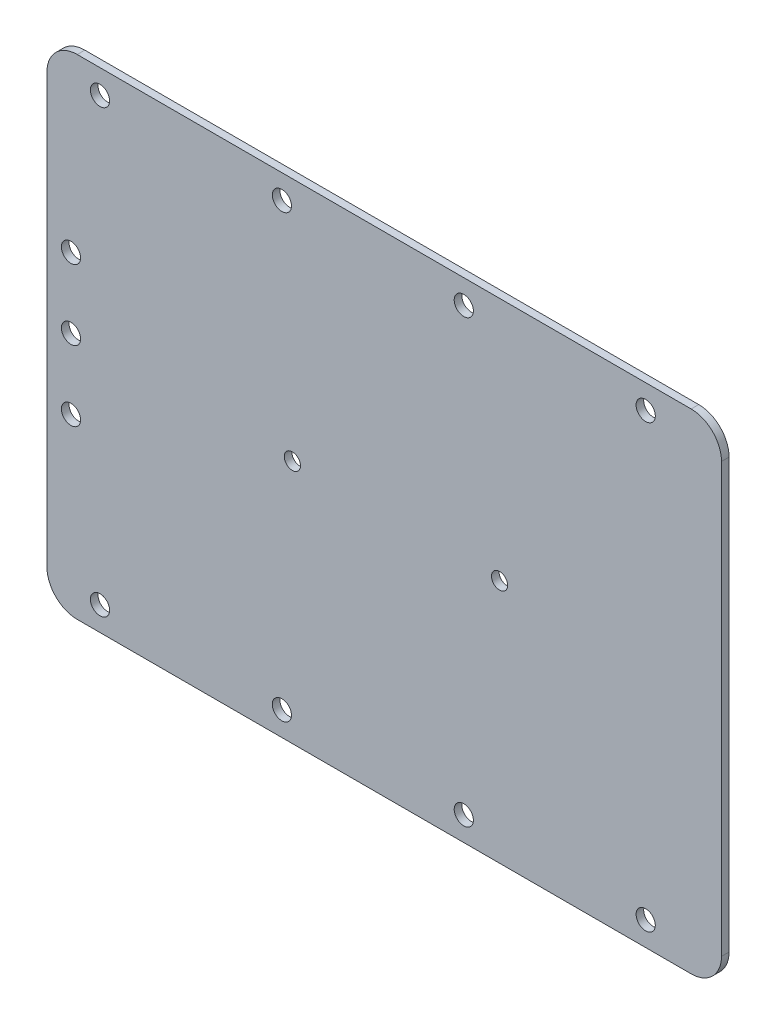
ISO-10303-21;
HEADER;
FILE_DESCRIPTION(('STEP AP214'),'2;1');
FILE_NAME('part.step','',(''),(''),'','','');
FILE_SCHEMA(('AUTOMOTIVE_DESIGN { 1 0 10303 214 1 1 1 1 }'));
ENDSEC;
DATA;
#1=APPLICATION_CONTEXT('core data for automotive mechanical design processes');
#2=APPLICATION_PROTOCOL_DEFINITION('international standard','automotive_design',2000,#1);
#3=PRODUCT_CONTEXT('',#1,'mechanical');
#4=PRODUCT('Part','Part','',(#3));
#5=PRODUCT_RELATED_PRODUCT_CATEGORY('part','',(#4));
#6=PRODUCT_DEFINITION_FORMATION('','',#4);
#7=PRODUCT_DEFINITION_CONTEXT('part definition',#1,'design');
#8=PRODUCT_DEFINITION('design','',#6,#7);
#9=PRODUCT_DEFINITION_SHAPE('','',#8);
#10=(LENGTH_UNIT() NAMED_UNIT(*) SI_UNIT(.MILLI.,.METRE.));
#11=(NAMED_UNIT(*) PLANE_ANGLE_UNIT() SI_UNIT($,.RADIAN.));
#12=(NAMED_UNIT(*) SI_UNIT($,.STERADIAN.) SOLID_ANGLE_UNIT());
#13=UNCERTAINTY_MEASURE_WITH_UNIT(LENGTH_MEASURE(1.E-05),#10,'distance_accuracy_value','');
#14=(GEOMETRIC_REPRESENTATION_CONTEXT(3) GLOBAL_UNCERTAINTY_ASSIGNED_CONTEXT((#13)) GLOBAL_UNIT_ASSIGNED_CONTEXT((#10,
#11,#12)) REPRESENTATION_CONTEXT('',''));
#15=CARTESIAN_POINT('',(0.,0.,0.));
#16=DIRECTION('',(0.,0.,1.));
#17=DIRECTION('',(1.,0.,0.));
#18=AXIS2_PLACEMENT_3D('',#15,#16,#17);
#19=CARTESIAN_POINT('',(-59.5125,-25.,1.5));
#20=DIRECTION('',(0.,0.,1.));
#21=DIRECTION('',(1.,0.,0.));
#22=AXIS2_PLACEMENT_3D('',#19,#20,#21);
#23=CYLINDRICAL_SURFACE('',#22,1.89864999999999);
#24=CARTESIAN_POINT('',(-59.5125,-25.,0.));
#25=DIRECTION('',(0.,0.,1.));
#26=DIRECTION('',(1.,0.,0.));
#27=AXIS2_PLACEMENT_3D('',#24,#25,#26);
#28=CIRCLE('',#27,1.89865);
#29=CARTESIAN_POINT('',(-57.61385,-25.,0.));
#30=VERTEX_POINT('',#29);
#31=EDGE_CURVE('E169',#30,#30,#28,.T.);
#32=ORIENTED_EDGE('',*,*,#31,.F.);
#33=EDGE_LOOP('',(#32));
#34=FACE_BOUND('',#33,.T.);
#35=CARTESIAN_POINT('',(-59.5125,-25.,1.5));
#36=DIRECTION('',(0.,0.,1.));
#37=DIRECTION('',(1.,0.,0.));
#38=AXIS2_PLACEMENT_3D('',#35,#36,#37);
#39=CIRCLE('',#38,1.89864999999999);
#40=CARTESIAN_POINT('',(-57.61385,-25.,1.5));
#41=VERTEX_POINT('',#40);
#42=EDGE_CURVE('E171',#41,#41,#39,.T.);
#43=ORIENTED_EDGE('',*,*,#42,.T.);
#44=EDGE_LOOP('',(#43));
#45=FACE_BOUND('',#44,.T.);
#46=ADVANCED_FACE('F41',(#34,#45),#23,.F.);
#47=CARTESIAN_POINT('',(-53.7733140139944,4.7625,1.5));
#48=DIRECTION('',(0.,0.,1.));
#49=DIRECTION('',(1.,0.,0.));
#50=AXIS2_PLACEMENT_3D('',#47,#48,#49);
#51=CYLINDRICAL_SURFACE('',#50,1.89864999999999);
#52=CARTESIAN_POINT('',(-53.7733140139944,4.7625,0.));
#53=DIRECTION('',(0.,0.,1.));
#54=DIRECTION('',(1.,0.,0.));
#55=AXIS2_PLACEMENT_3D('',#52,#53,#54);
#56=CIRCLE('',#55,1.89865);
#57=CARTESIAN_POINT('',(-51.8746640139944,4.7625,0.));
#58=VERTEX_POINT('',#57);
#59=EDGE_CURVE('E159',#58,#58,#56,.T.);
#60=ORIENTED_EDGE('',*,*,#59,.F.);
#61=EDGE_LOOP('',(#60));
#62=FACE_BOUND('',#61,.T.);
#63=CARTESIAN_POINT('',(-53.7733140139944,4.7625,1.5));
#64=DIRECTION('',(0.,0.,1.));
#65=DIRECTION('',(1.,0.,0.));
#66=AXIS2_PLACEMENT_3D('',#63,#64,#65);
#67=CIRCLE('',#66,1.89864999999999);
#68=CARTESIAN_POINT('',(-51.8746640139944,4.7625,1.5));
#69=VERTEX_POINT('',#68);
#70=EDGE_CURVE('E165',#69,#69,#67,.T.);
#71=ORIENTED_EDGE('',*,*,#70,.T.);
#72=EDGE_LOOP('',(#71));
#73=FACE_BOUND('',#72,.T.);
#74=ADVANCED_FACE('F334',(#62,#73),#51,.F.);
#75=CARTESIAN_POINT('',(-17.7733140139944,4.7625,1.5));
#76=DIRECTION('',(0.,0.,1.));
#77=DIRECTION('',(1.,0.,0.));
#78=AXIS2_PLACEMENT_3D('',#75,#76,#77);
#79=CYLINDRICAL_SURFACE('',#78,1.89864999999999);
#80=CARTESIAN_POINT('',(-17.7733140139944,4.7625,0.));
#81=DIRECTION('',(0.,0.,1.));
#82=DIRECTION('',(1.,0.,0.));
#83=AXIS2_PLACEMENT_3D('',#80,#81,#82);
#84=CIRCLE('',#83,1.89865);
#85=CARTESIAN_POINT('',(-15.8746640139944,4.7625,0.));
#86=VERTEX_POINT('',#85);
#87=EDGE_CURVE('E152',#86,#86,#84,.T.);
#88=ORIENTED_EDGE('',*,*,#87,.F.);
#89=EDGE_LOOP('',(#88));
#90=FACE_BOUND('',#89,.T.);
#91=CARTESIAN_POINT('',(-17.7733140139944,4.7625,1.5));
#92=DIRECTION('',(0.,0.,1.));
#93=DIRECTION('',(1.,0.,0.));
#94=AXIS2_PLACEMENT_3D('',#91,#92,#93);
#95=CIRCLE('',#94,1.89864999999999);
#96=CARTESIAN_POINT('',(-15.8746640139944,4.7625,1.5));
#97=VERTEX_POINT('',#96);
#98=EDGE_CURVE('E155',#97,#97,#95,.T.);
#99=ORIENTED_EDGE('',*,*,#98,.T.);
#100=EDGE_LOOP('',(#99));
#101=FACE_BOUND('',#100,.T.);
#102=ADVANCED_FACE('F340',(#90,#101),#79,.F.);
#103=CARTESIAN_POINT('',(69.2266859860056,-87.3,1.5));
#104=DIRECTION('',(0.,1.,0.));
#105=DIRECTION('',(0.,0.,1.));
#106=AXIS2_PLACEMENT_3D('',#103,#104,#105);
#107=PLANE('',#106);
#108=DIRECTION('',(1.,0.,0.));
#109=VECTOR('',#108,1.);
#110=CARTESIAN_POINT('',(69.2266859860056,-87.3,1.5));
#111=LINE('',#110,#109);
#112=CARTESIAN_POINT('',(-58.275,-87.3,1.5));
#113=VERTEX_POINT('',#112);
#114=CARTESIAN_POINT('',(63.2266859860056,-87.3,1.5));
#115=VERTEX_POINT('',#114);
#116=EDGE_CURVE('E127',#113,#115,#111,.T.);
#117=ORIENTED_EDGE('',*,*,#116,.F.);
#118=DIRECTION('',(0.,0.,-1.));
#119=VECTOR('',#118,1.);
#120=CARTESIAN_POINT('',(-58.275,-87.3,1.5));
#121=LINE('',#120,#119);
#122=CARTESIAN_POINT('',(-58.275,-87.3,0.));
#123=VERTEX_POINT('',#122);
#124=EDGE_CURVE('E111',#113,#123,#121,.T.);
#125=ORIENTED_EDGE('',*,*,#124,.T.);
#126=DIRECTION('',(1.,0.,0.));
#127=VECTOR('',#126,1.);
#128=CARTESIAN_POINT('',(69.2266859860056,-87.3,0.));
#129=LINE('',#128,#127);
#130=CARTESIAN_POINT('',(63.2266859860056,-87.3,0.));
#131=VERTEX_POINT('',#130);
#132=EDGE_CURVE('E124',#123,#131,#129,.T.);
#133=ORIENTED_EDGE('',*,*,#132,.T.);
#134=DIRECTION('',(0.,0.,-1.));
#135=VECTOR('',#134,1.);
#136=CARTESIAN_POINT('',(63.2266859860056,-87.3,1.5));
#137=LINE('',#136,#135);
#138=EDGE_CURVE('E129',#131,#115,#137,.F.);
#139=ORIENTED_EDGE('',*,*,#138,.T.);
#140=EDGE_LOOP('',(#117,#125,#133,#139));
#141=FACE_BOUND('',#140,.T.);
#142=ADVANCED_FACE('F123',(#141),#107,.F.);
#143=CARTESIAN_POINT('',(69.2266859860056,9.525,1.5));
#144=DIRECTION('',(-1.,0.,0.));
#145=DIRECTION('',(0.,0.,1.));
#146=AXIS2_PLACEMENT_3D('',#143,#144,#145);
#147=PLANE('',#146);
#148=DIRECTION('',(0.,1.,0.));
#149=VECTOR('',#148,1.);
#150=CARTESIAN_POINT('',(69.2266859860056,9.525,0.));
#151=LINE('',#150,#149);
#152=CARTESIAN_POINT('',(69.2266859860056,-81.3,0.));
#153=VERTEX_POINT('',#152);
#154=CARTESIAN_POINT('',(69.2266859860056,3.525,0.));
#155=VERTEX_POINT('',#154);
#156=EDGE_CURVE('E135',#153,#155,#151,.T.);
#157=ORIENTED_EDGE('',*,*,#156,.T.);
#158=DIRECTION('',(0.,0.,-1.));
#159=VECTOR('',#158,1.);
#160=CARTESIAN_POINT('',(69.2266859860056,3.525,1.5));
#161=LINE('',#160,#159);
#162=CARTESIAN_POINT('',(69.2266859860056,3.525,1.5));
#163=VERTEX_POINT('',#162);
#164=EDGE_CURVE('E12',#155,#163,#161,.F.);
#165=ORIENTED_EDGE('',*,*,#164,.T.);
#166=DIRECTION('',(0.,1.,0.));
#167=VECTOR('',#166,1.);
#168=CARTESIAN_POINT('',(69.2266859860056,9.525,1.5));
#169=LINE('',#168,#167);
#170=CARTESIAN_POINT('',(69.2266859860056,-81.3,1.5));
#171=VERTEX_POINT('',#170);
#172=EDGE_CURVE('E196',#171,#163,#169,.T.);
#173=ORIENTED_EDGE('',*,*,#172,.F.);
#174=DIRECTION('',(0.,0.,-1.));
#175=VECTOR('',#174,1.);
#176=CARTESIAN_POINT('',(69.2266859860056,-81.3,1.5));
#177=LINE('',#176,#175);
#178=EDGE_CURVE('E49',#171,#153,#177,.T.);
#179=ORIENTED_EDGE('',*,*,#178,.T.);
#180=EDGE_LOOP('',(#157,#165,#173,#179));
#181=FACE_BOUND('',#180,.T.);
#182=ADVANCED_FACE('F366',(#181),#147,.F.);
#183=CARTESIAN_POINT('',(69.2266859860056,9.525,1.5));
#184=DIRECTION('',(0.,-1.,0.));
#185=DIRECTION('',(1.,0.,0.));
#186=AXIS2_PLACEMENT_3D('',#183,#184,#185);
#187=PLANE('',#186);
#188=DIRECTION('',(-1.,0.,0.));
#189=VECTOR('',#188,1.);
#190=CARTESIAN_POINT('',(69.2266859860056,9.525,1.5));
#191=LINE('',#190,#189);
#192=CARTESIAN_POINT('',(63.2266859860056,9.525,1.5));
#193=VERTEX_POINT('',#192);
#194=CARTESIAN_POINT('',(-58.275,9.525,1.5));
#195=VERTEX_POINT('',#194);
#196=EDGE_CURVE('E198',#193,#195,#191,.T.);
#197=ORIENTED_EDGE('',*,*,#196,.F.);
#198=DIRECTION('',(0.,0.,-1.));
#199=VECTOR('',#198,1.);
#200=CARTESIAN_POINT('',(63.2266859860056,9.525,1.5));
#201=LINE('',#200,#199);
#202=CARTESIAN_POINT('',(63.2266859860056,9.525,0.));
#203=VERTEX_POINT('',#202);
#204=EDGE_CURVE('E209',#193,#203,#201,.T.);
#205=ORIENTED_EDGE('',*,*,#204,.T.);
#206=DIRECTION('',(-1.,0.,0.));
#207=VECTOR('',#206,1.);
#208=CARTESIAN_POINT('',(69.2266859860056,9.525,0.));
#209=LINE('',#208,#207);
#210=CARTESIAN_POINT('',(-58.275,9.525,0.));
#211=VERTEX_POINT('',#210);
#212=EDGE_CURVE('E139',#203,#211,#209,.T.);
#213=ORIENTED_EDGE('',*,*,#212,.T.);
#214=DIRECTION('',(0.,0.,-1.));
#215=VECTOR('',#214,1.);
#216=CARTESIAN_POINT('',(-58.275,9.525,1.5));
#217=LINE('',#216,#215);
#218=EDGE_CURVE('E56',#211,#195,#217,.F.);
#219=ORIENTED_EDGE('',*,*,#218,.T.);
#220=EDGE_LOOP('',(#197,#205,#213,#219));
#221=FACE_BOUND('',#220,.T.);
#222=ADVANCED_FACE('F330',(#221),#187,.F.);
#223=CARTESIAN_POINT('',(-64.275,9.525,1.5));
#224=DIRECTION('',(1.,0.,0.));
#225=DIRECTION('',(0.,1.,0.));
#226=AXIS2_PLACEMENT_3D('',#223,#224,#225);
#227=PLANE('',#226);
#228=DIRECTION('',(0.,-1.,0.));
#229=VECTOR('',#228,1.);
#230=CARTESIAN_POINT('',(-64.275,9.525,0.));
#231=LINE('',#230,#229);
#232=CARTESIAN_POINT('',(-64.275,3.525,0.));
#233=VERTEX_POINT('',#232);
#234=CARTESIAN_POINT('',(-64.275,-81.3,0.));
#235=VERTEX_POINT('',#234);
#236=EDGE_CURVE('E150',#233,#235,#231,.T.);
#237=ORIENTED_EDGE('',*,*,#236,.T.);
#238=DIRECTION('',(0.,0.,-1.));
#239=VECTOR('',#238,1.);
#240=CARTESIAN_POINT('',(-64.275,-81.3,1.5));
#241=LINE('',#240,#239);
#242=CARTESIAN_POINT('',(-64.275,-81.3,1.5));
#243=VERTEX_POINT('',#242);
#244=EDGE_CURVE('E112',#235,#243,#241,.F.);
#245=ORIENTED_EDGE('',*,*,#244,.T.);
#246=DIRECTION('',(0.,-1.,0.));
#247=VECTOR('',#246,1.);
#248=CARTESIAN_POINT('',(-64.275,9.525,1.5));
#249=LINE('',#248,#247);
#250=CARTESIAN_POINT('',(-64.275,3.525,1.5));
#251=VERTEX_POINT('',#250);
#252=EDGE_CURVE('E145',#251,#243,#249,.T.);
#253=ORIENTED_EDGE('',*,*,#252,.F.);
#254=DIRECTION('',(0.,0.,-1.));
#255=VECTOR('',#254,1.);
#256=CARTESIAN_POINT('',(-64.275,3.52499999999999,1.5));
#257=LINE('',#256,#255);
#258=EDGE_CURVE('E117',#251,#233,#257,.T.);
#259=ORIENTED_EDGE('',*,*,#258,.T.);
#260=EDGE_LOOP('',(#237,#245,#253,#259));
#261=FACE_BOUND('',#260,.T.);
#262=ADVANCED_FACE('F325',(#261),#227,.F.);
#263=CARTESIAN_POINT('',(0.,0.,1.5));
#264=DIRECTION('',(0.,0.,1.));
#265=DIRECTION('',(1.,0.,0.));
#266=AXIS2_PLACEMENT_3D('',#263,#264,#265);
#267=PLANE('',#266);
#268=CARTESIAN_POINT('',(25.3010310682912,-38.8875101700014,1.5));
#269=DIRECTION('',(0.,0.,-1.));
#270=DIRECTION('',(-1.,0.,0.));
#271=AXIS2_PLACEMENT_3D('',#268,#269,#270);
#272=CIRCLE('',#271,1.6);
#273=CARTESIAN_POINT('',(23.7010310682912,-38.8875101700014,1.5));
#274=VERTEX_POINT('',#273);
#275=EDGE_CURVE('E274',#274,#274,#272,.T.);
#276=ORIENTED_EDGE('',*,*,#275,.T.);
#277=EDGE_LOOP('',(#276));
#278=FACE_BOUND('',#277,.T.);
#279=CARTESIAN_POINT('',(-15.699384734954,-38.8873831690102,1.5));
#280=DIRECTION('',(0.,0.,-1.));
#281=DIRECTION('',(-1.,0.,0.));
#282=AXIS2_PLACEMENT_3D('',#279,#280,#281);
#283=CIRCLE('',#282,1.6);
#284=CARTESIAN_POINT('',(-17.299384734954,-38.8873831690102,1.5));
#285=VERTEX_POINT('',#284);
#286=EDGE_CURVE('E278',#285,#285,#283,.T.);
#287=ORIENTED_EDGE('',*,*,#286,.T.);
#288=EDGE_LOOP('',(#287));
#289=FACE_BOUND('',#288,.T.);
#290=CARTESIAN_POINT('',(-59.5125,-38.8875,1.5));
#291=DIRECTION('',(0.,0.,1.));
#292=DIRECTION('',(1.,0.,0.));
#293=AXIS2_PLACEMENT_3D('',#290,#291,#292);
#294=CIRCLE('',#293,1.89864999999999);
#295=CARTESIAN_POINT('',(-57.61385,-38.8875,1.5));
#296=VERTEX_POINT('',#295);
#297=EDGE_CURVE('E267',#296,#296,#294,.T.);
#298=ORIENTED_EDGE('',*,*,#297,.F.);
#299=EDGE_LOOP('',(#298));
#300=FACE_BOUND('',#299,.T.);
#301=CARTESIAN_POINT('',(-59.5125,-52.775,1.5));
#302=DIRECTION('',(0.,0.,1.));
#303=DIRECTION('',(1.,0.,0.));
#304=AXIS2_PLACEMENT_3D('',#301,#302,#303);
#305=CIRCLE('',#304,1.89864999999999);
#306=CARTESIAN_POINT('',(-57.61385,-52.775,1.5));
#307=VERTEX_POINT('',#306);
#308=EDGE_CURVE('E264',#307,#307,#305,.T.);
#309=ORIENTED_EDGE('',*,*,#308,.F.);
#310=EDGE_LOOP('',(#309));
#311=FACE_BOUND('',#310,.T.);
#312=CARTESIAN_POINT('',(-53.7733140139944,-82.5375,1.5));
#313=DIRECTION('',(0.,0.,1.));
#314=DIRECTION('',(1.,0.,0.));
#315=AXIS2_PLACEMENT_3D('',#312,#313,#314);
#316=CIRCLE('',#315,1.89864999999999);
#317=CARTESIAN_POINT('',(-51.8746640139944,-82.5375,1.5));
#318=VERTEX_POINT('',#317);
#319=EDGE_CURVE('E254',#318,#318,#316,.T.);
#320=ORIENTED_EDGE('',*,*,#319,.F.);
#321=EDGE_LOOP('',(#320));
#322=FACE_BOUND('',#321,.T.);
#323=CARTESIAN_POINT('',(-17.7733140139944,-82.5375,1.5));
#324=DIRECTION('',(0.,0.,1.));
#325=DIRECTION('',(1.,0.,0.));
#326=AXIS2_PLACEMENT_3D('',#323,#324,#325);
#327=CIRCLE('',#326,1.89864999999999);
#328=CARTESIAN_POINT('',(-15.8746640139944,-82.5375,1.5));
#329=VERTEX_POINT('',#328);
#330=EDGE_CURVE('E247',#329,#329,#327,.T.);
#331=ORIENTED_EDGE('',*,*,#330,.F.);
#332=EDGE_LOOP('',(#331));
#333=FACE_BOUND('',#332,.T.);
#334=CARTESIAN_POINT('',(18.2266859860056,-82.5375,1.5));
#335=DIRECTION('',(0.,0.,1.));
#336=DIRECTION('',(1.,0.,0.));
#337=AXIS2_PLACEMENT_3D('',#334,#335,#336);
#338=CIRCLE('',#337,1.89864999999999);
#339=CARTESIAN_POINT('',(20.1253359860056,-82.5375,1.5));
#340=VERTEX_POINT('',#339);
#341=EDGE_CURVE('E241',#340,#340,#338,.T.);
#342=ORIENTED_EDGE('',*,*,#341,.F.);
#343=EDGE_LOOP('',(#342));
#344=FACE_BOUND('',#343,.T.);
#345=CARTESIAN_POINT('',(54.2266859860056,-82.5375,1.5));
#346=DIRECTION('',(0.,0.,1.));
#347=DIRECTION('',(1.,0.,0.));
#348=AXIS2_PLACEMENT_3D('',#345,#346,#347);
#349=CIRCLE('',#348,1.89864999999999);
#350=CARTESIAN_POINT('',(56.1253359860056,-82.5375,1.5));
#351=VERTEX_POINT('',#350);
#352=EDGE_CURVE('E231',#351,#351,#349,.T.);
#353=ORIENTED_EDGE('',*,*,#352,.F.);
#354=EDGE_LOOP('',(#353));
#355=FACE_BOUND('',#354,.T.);
#356=CARTESIAN_POINT('',(18.2266859860056,4.7625,1.5));
#357=DIRECTION('',(0.,0.,1.));
#358=DIRECTION('',(1.,0.,0.));
#359=AXIS2_PLACEMENT_3D('',#356,#357,#358);
#360=CIRCLE('',#359,1.89864999999999);
#361=CARTESIAN_POINT('',(20.1253359860056,4.7625,1.5));
#362=VERTEX_POINT('',#361);
#363=EDGE_CURVE('E221',#362,#362,#360,.T.);
#364=ORIENTED_EDGE('',*,*,#363,.F.);
#365=EDGE_LOOP('',(#364));
#366=FACE_BOUND('',#365,.T.);
#367=CARTESIAN_POINT('',(54.2266859860056,4.7625,1.5));
#368=DIRECTION('',(0.,0.,1.));
#369=DIRECTION('',(1.,0.,0.));
#370=AXIS2_PLACEMENT_3D('',#367,#368,#369);
#371=CIRCLE('',#370,1.89864999999999);
#372=CARTESIAN_POINT('',(56.1253359860056,4.7625,1.5));
#373=VERTEX_POINT('',#372);
#374=EDGE_CURVE('E142',#373,#373,#371,.T.);
#375=ORIENTED_EDGE('',*,*,#374,.F.);
#376=EDGE_LOOP('',(#375));
#377=FACE_BOUND('',#376,.T.);
#378=ORIENTED_EDGE('',*,*,#252,.T.);
#379=CARTESIAN_POINT('',(-58.275,-81.3,1.5));
#380=DIRECTION('',(0.,0.,1.));
#381=DIRECTION('',(1.,0.,0.));
#382=AXIS2_PLACEMENT_3D('',#379,#380,#381);
#383=CIRCLE('',#382,6.);
#384=EDGE_CURVE('E206',#243,#113,#383,.T.);
#385=ORIENTED_EDGE('',*,*,#384,.T.);
#386=ORIENTED_EDGE('',*,*,#116,.T.);
#387=CARTESIAN_POINT('',(63.2266859860056,-81.3,1.5));
#388=DIRECTION('',(0.,0.,1.));
#389=DIRECTION('',(1.,0.,0.));
#390=AXIS2_PLACEMENT_3D('',#387,#388,#389);
#391=CIRCLE('',#390,6.);
#392=EDGE_CURVE('E184',#115,#171,#391,.T.);
#393=ORIENTED_EDGE('',*,*,#392,.T.);
#394=ORIENTED_EDGE('',*,*,#172,.T.);
#395=CARTESIAN_POINT('',(63.2266859860056,3.525,1.5));
#396=DIRECTION('',(0.,0.,1.));
#397=DIRECTION('',(1.,0.,0.));
#398=AXIS2_PLACEMENT_3D('',#395,#396,#397);
#399=CIRCLE('',#398,6.);
#400=EDGE_CURVE('E63',#163,#193,#399,.T.);
#401=ORIENTED_EDGE('',*,*,#400,.T.);
#402=ORIENTED_EDGE('',*,*,#196,.T.);
#403=CARTESIAN_POINT('',(-58.275,3.525,1.5));
#404=DIRECTION('',(0.,0.,1.));
#405=DIRECTION('',(1.,0.,0.));
#406=AXIS2_PLACEMENT_3D('',#403,#404,#405);
#407=CIRCLE('',#406,6.);
#408=EDGE_CURVE('E181',#195,#251,#407,.T.);
#409=ORIENTED_EDGE('',*,*,#408,.T.);
#410=EDGE_LOOP('',(#378,#385,#386,#393,#394,#401,#402,#409));
#411=FACE_BOUND('',#410,.T.);
#412=ORIENTED_EDGE('',*,*,#98,.F.);
#413=EDGE_LOOP('',(#412));
#414=FACE_BOUND('',#413,.T.);
#415=ORIENTED_EDGE('',*,*,#70,.F.);
#416=EDGE_LOOP('',(#415));
#417=FACE_BOUND('',#416,.T.);
#418=ORIENTED_EDGE('',*,*,#42,.F.);
#419=EDGE_LOOP('',(#418));
#420=FACE_BOUND('',#419,.T.);
#421=ADVANCED_FACE('F204',(#278,#289,#300,#311,#322,#333,#344,#355,#366,#377,#411,#414,#417,
#420),#267,.T.);
#422=CARTESIAN_POINT('',(0.,0.,0.));
#423=DIRECTION('',(0.,0.,1.));
#424=DIRECTION('',(1.,0.,0.));
#425=AXIS2_PLACEMENT_3D('',#422,#423,#424);
#426=PLANE('',#425);
#427=CARTESIAN_POINT('',(25.3010310682912,-38.8875101700014,0.));
#428=DIRECTION('',(0.,0.,-1.));
#429=DIRECTION('',(-1.,0.,0.));
#430=AXIS2_PLACEMENT_3D('',#427,#428,#429);
#431=CIRCLE('',#430,1.6);
#432=CARTESIAN_POINT('',(23.7010310682912,-38.8875101700014,0.));
#433=VERTEX_POINT('',#432);
#434=EDGE_CURVE('E282',#433,#433,#431,.T.);
#435=ORIENTED_EDGE('',*,*,#434,.F.);
#436=EDGE_LOOP('',(#435));
#437=FACE_BOUND('',#436,.T.);
#438=CARTESIAN_POINT('',(-15.699384734954,-38.8873831690102,0.));
#439=DIRECTION('',(0.,0.,-1.));
#440=DIRECTION('',(-1.,0.,0.));
#441=AXIS2_PLACEMENT_3D('',#438,#439,#440);
#442=CIRCLE('',#441,1.6);
#443=CARTESIAN_POINT('',(-17.299384734954,-38.8873831690102,0.));
#444=VERTEX_POINT('',#443);
#445=EDGE_CURVE('E275',#444,#444,#442,.T.);
#446=ORIENTED_EDGE('',*,*,#445,.F.);
#447=EDGE_LOOP('',(#446));
#448=FACE_BOUND('',#447,.T.);
#449=CARTESIAN_POINT('',(-59.5125,-38.8875,0.));
#450=DIRECTION('',(0.,0.,1.));
#451=DIRECTION('',(1.,0.,0.));
#452=AXIS2_PLACEMENT_3D('',#449,#450,#451);
#453=CIRCLE('',#452,1.89865);
#454=CARTESIAN_POINT('',(-57.61385,-38.8875,0.));
#455=VERTEX_POINT('',#454);
#456=EDGE_CURVE('E271',#455,#455,#453,.T.);
#457=ORIENTED_EDGE('',*,*,#456,.T.);
#458=EDGE_LOOP('',(#457));
#459=FACE_BOUND('',#458,.T.);
#460=CARTESIAN_POINT('',(-59.5125,-52.775,0.));
#461=DIRECTION('',(0.,0.,1.));
#462=DIRECTION('',(1.,0.,0.));
#463=AXIS2_PLACEMENT_3D('',#460,#461,#462);
#464=CIRCLE('',#463,1.89865);
#465=CARTESIAN_POINT('',(-57.61385,-52.775,0.));
#466=VERTEX_POINT('',#465);
#467=EDGE_CURVE('E258',#466,#466,#464,.T.);
#468=ORIENTED_EDGE('',*,*,#467,.T.);
#469=EDGE_LOOP('',(#468));
#470=FACE_BOUND('',#469,.T.);
#471=CARTESIAN_POINT('',(-53.7733140139944,-82.5375,0.));
#472=DIRECTION('',(0.,0.,1.));
#473=DIRECTION('',(1.,0.,0.));
#474=AXIS2_PLACEMENT_3D('',#471,#472,#473);
#475=CIRCLE('',#474,1.89865);
#476=CARTESIAN_POINT('',(-51.8746640139944,-82.5375,0.));
#477=VERTEX_POINT('',#476);
#478=EDGE_CURVE('E251',#477,#477,#475,.T.);
#479=ORIENTED_EDGE('',*,*,#478,.T.);
#480=EDGE_LOOP('',(#479));
#481=FACE_BOUND('',#480,.T.);
#482=CARTESIAN_POINT('',(-17.7733140139944,-82.5375,0.));
#483=DIRECTION('',(0.,0.,1.));
#484=DIRECTION('',(1.,0.,0.));
#485=AXIS2_PLACEMENT_3D('',#482,#483,#484);
#486=CIRCLE('',#485,1.89865);
#487=CARTESIAN_POINT('',(-15.8746640139944,-82.5375,0.));
#488=VERTEX_POINT('',#487);
#489=EDGE_CURVE('E245',#488,#488,#486,.T.);
#490=ORIENTED_EDGE('',*,*,#489,.T.);
#491=EDGE_LOOP('',(#490));
#492=FACE_BOUND('',#491,.T.);
#493=CARTESIAN_POINT('',(18.2266859860056,-82.5375,0.));
#494=DIRECTION('',(0.,0.,1.));
#495=DIRECTION('',(1.,0.,0.));
#496=AXIS2_PLACEMENT_3D('',#493,#494,#495);
#497=CIRCLE('',#496,1.89865);
#498=CARTESIAN_POINT('',(20.1253359860056,-82.5375,0.));
#499=VERTEX_POINT('',#498);
#500=EDGE_CURVE('E235',#499,#499,#497,.T.);
#501=ORIENTED_EDGE('',*,*,#500,.T.);
#502=EDGE_LOOP('',(#501));
#503=FACE_BOUND('',#502,.T.);
#504=CARTESIAN_POINT('',(54.2266859860056,-82.5375,0.));
#505=DIRECTION('',(0.,0.,1.));
#506=DIRECTION('',(1.,0.,0.));
#507=AXIS2_PLACEMENT_3D('',#504,#505,#506);
#508=CIRCLE('',#507,1.89865);
#509=CARTESIAN_POINT('',(56.1253359860056,-82.5375,0.));
#510=VERTEX_POINT('',#509);
#511=EDGE_CURVE('E228',#510,#510,#508,.T.);
#512=ORIENTED_EDGE('',*,*,#511,.T.);
#513=EDGE_LOOP('',(#512));
#514=FACE_BOUND('',#513,.T.);
#515=CARTESIAN_POINT('',(18.2266859860056,4.7625,0.));
#516=DIRECTION('',(0.,0.,1.));
#517=DIRECTION('',(1.,0.,0.));
#518=AXIS2_PLACEMENT_3D('',#515,#516,#517);
#519=CIRCLE('',#518,1.89865);
#520=CARTESIAN_POINT('',(20.1253359860056,4.7625,0.));
#521=VERTEX_POINT('',#520);
#522=EDGE_CURVE('E225',#521,#521,#519,.T.);
#523=ORIENTED_EDGE('',*,*,#522,.T.);
#524=EDGE_LOOP('',(#523));
#525=FACE_BOUND('',#524,.T.);
#526=CARTESIAN_POINT('',(54.2266859860056,4.7625,0.));
#527=DIRECTION('',(0.,0.,1.));
#528=DIRECTION('',(1.,0.,0.));
#529=AXIS2_PLACEMENT_3D('',#526,#527,#528);
#530=CIRCLE('',#529,1.89865);
#531=CARTESIAN_POINT('',(56.1253359860056,4.7625,0.));
#532=VERTEX_POINT('',#531);
#533=EDGE_CURVE('E136',#532,#532,#530,.T.);
#534=ORIENTED_EDGE('',*,*,#533,.T.);
#535=EDGE_LOOP('',(#534));
#536=FACE_BOUND('',#535,.T.);
#537=ORIENTED_EDGE('',*,*,#132,.F.);
#538=CARTESIAN_POINT('',(-58.275,-81.3,0.));
#539=DIRECTION('',(0.,0.,1.));
#540=DIRECTION('',(1.,0.,0.));
#541=AXIS2_PLACEMENT_3D('',#538,#539,#540);
#542=CIRCLE('',#541,6.);
#543=EDGE_CURVE('E107',#123,#235,#542,.F.);
#544=ORIENTED_EDGE('',*,*,#543,.T.);
#545=ORIENTED_EDGE('',*,*,#236,.F.);
#546=CARTESIAN_POINT('',(-58.275,3.525,0.));
#547=DIRECTION('',(0.,0.,1.));
#548=DIRECTION('',(1.,0.,0.));
#549=AXIS2_PLACEMENT_3D('',#546,#547,#548);
#550=CIRCLE('',#549,6.);
#551=EDGE_CURVE('E128',#233,#211,#550,.F.);
#552=ORIENTED_EDGE('',*,*,#551,.T.);
#553=ORIENTED_EDGE('',*,*,#212,.F.);
#554=CARTESIAN_POINT('',(63.2266859860056,3.525,0.));
#555=DIRECTION('',(0.,0.,1.));
#556=DIRECTION('',(1.,0.,0.));
#557=AXIS2_PLACEMENT_3D('',#554,#555,#556);
#558=CIRCLE('',#557,6.);
#559=EDGE_CURVE('E118',#203,#155,#558,.F.);
#560=ORIENTED_EDGE('',*,*,#559,.T.);
#561=ORIENTED_EDGE('',*,*,#156,.F.);
#562=CARTESIAN_POINT('',(63.2266859860056,-81.3,0.));
#563=DIRECTION('',(0.,0.,1.));
#564=DIRECTION('',(1.,0.,0.));
#565=AXIS2_PLACEMENT_3D('',#562,#563,#564);
#566=CIRCLE('',#565,6.);
#567=EDGE_CURVE('E134',#153,#131,#566,.F.);
#568=ORIENTED_EDGE('',*,*,#567,.T.);
#569=EDGE_LOOP('',(#537,#544,#545,#552,#553,#560,#561,#568));
#570=FACE_BOUND('',#569,.T.);
#571=ORIENTED_EDGE('',*,*,#87,.T.);
#572=EDGE_LOOP('',(#571));
#573=FACE_BOUND('',#572,.T.);
#574=ORIENTED_EDGE('',*,*,#59,.T.);
#575=EDGE_LOOP('',(#574));
#576=FACE_BOUND('',#575,.T.);
#577=ORIENTED_EDGE('',*,*,#31,.T.);
#578=EDGE_LOOP('',(#577));
#579=FACE_BOUND('',#578,.T.);
#580=ADVANCED_FACE('F131',(#437,#448,#459,#470,#481,#492,#503,#514,#525,#536,#570,#573,#576,
#579),#426,.F.);
#581=CARTESIAN_POINT('',(54.2266859860056,4.7625,1.5));
#582=DIRECTION('',(0.,0.,1.));
#583=DIRECTION('',(1.,0.,0.));
#584=AXIS2_PLACEMENT_3D('',#581,#582,#583);
#585=CYLINDRICAL_SURFACE('',#584,1.89864999999999);
#586=ORIENTED_EDGE('',*,*,#533,.F.);
#587=EDGE_LOOP('',(#586));
#588=FACE_BOUND('',#587,.T.);
#589=ORIENTED_EDGE('',*,*,#374,.T.);
#590=EDGE_LOOP('',(#589));
#591=FACE_BOUND('',#590,.T.);
#592=ADVANCED_FACE('F296',(#588,#591),#585,.F.);
#593=CARTESIAN_POINT('',(18.2266859860056,4.7625,1.5));
#594=DIRECTION('',(0.,0.,1.));
#595=DIRECTION('',(1.,0.,0.));
#596=AXIS2_PLACEMENT_3D('',#593,#594,#595);
#597=CYLINDRICAL_SURFACE('',#596,1.89864999999999);
#598=ORIENTED_EDGE('',*,*,#522,.F.);
#599=EDGE_LOOP('',(#598));
#600=FACE_BOUND('',#599,.T.);
#601=ORIENTED_EDGE('',*,*,#363,.T.);
#602=EDGE_LOOP('',(#601));
#603=FACE_BOUND('',#602,.T.);
#604=ADVANCED_FACE('F320',(#600,#603),#597,.F.);
#605=CARTESIAN_POINT('',(54.2266859860056,-82.5375,1.5));
#606=DIRECTION('',(0.,0.,1.));
#607=DIRECTION('',(1.,0.,0.));
#608=AXIS2_PLACEMENT_3D('',#605,#606,#607);
#609=CYLINDRICAL_SURFACE('',#608,1.89864999999999);
#610=ORIENTED_EDGE('',*,*,#511,.F.);
#611=EDGE_LOOP('',(#610));
#612=FACE_BOUND('',#611,.T.);
#613=ORIENTED_EDGE('',*,*,#352,.T.);
#614=EDGE_LOOP('',(#613));
#615=FACE_BOUND('',#614,.T.);
#616=ADVANCED_FACE('F492',(#612,#615),#609,.F.);
#617=CARTESIAN_POINT('',(18.2266859860056,-82.5375,1.5));
#618=DIRECTION('',(0.,0.,1.));
#619=DIRECTION('',(1.,0.,0.));
#620=AXIS2_PLACEMENT_3D('',#617,#618,#619);
#621=CYLINDRICAL_SURFACE('',#620,1.89864999999999);
#622=ORIENTED_EDGE('',*,*,#500,.F.);
#623=EDGE_LOOP('',(#622));
#624=FACE_BOUND('',#623,.T.);
#625=ORIENTED_EDGE('',*,*,#341,.T.);
#626=EDGE_LOOP('',(#625));
#627=FACE_BOUND('',#626,.T.);
#628=ADVANCED_FACE('F488',(#624,#627),#621,.F.);
#629=CARTESIAN_POINT('',(-17.7733140139944,-82.5375,1.5));
#630=DIRECTION('',(0.,0.,1.));
#631=DIRECTION('',(1.,0.,0.));
#632=AXIS2_PLACEMENT_3D('',#629,#630,#631);
#633=CYLINDRICAL_SURFACE('',#632,1.89864999999999);
#634=ORIENTED_EDGE('',*,*,#489,.F.);
#635=EDGE_LOOP('',(#634));
#636=FACE_BOUND('',#635,.T.);
#637=ORIENTED_EDGE('',*,*,#330,.T.);
#638=EDGE_LOOP('',(#637));
#639=FACE_BOUND('',#638,.T.);
#640=ADVANCED_FACE('F484',(#636,#639),#633,.F.);
#641=CARTESIAN_POINT('',(-53.7733140139944,-82.5375,1.5));
#642=DIRECTION('',(0.,0.,1.));
#643=DIRECTION('',(1.,0.,0.));
#644=AXIS2_PLACEMENT_3D('',#641,#642,#643);
#645=CYLINDRICAL_SURFACE('',#644,1.89864999999999);
#646=ORIENTED_EDGE('',*,*,#478,.F.);
#647=EDGE_LOOP('',(#646));
#648=FACE_BOUND('',#647,.T.);
#649=ORIENTED_EDGE('',*,*,#319,.T.);
#650=EDGE_LOOP('',(#649));
#651=FACE_BOUND('',#650,.T.);
#652=ADVANCED_FACE('F480',(#648,#651),#645,.F.);
#653=CARTESIAN_POINT('',(-59.5125,-52.775,1.5));
#654=DIRECTION('',(0.,0.,1.));
#655=DIRECTION('',(1.,0.,0.));
#656=AXIS2_PLACEMENT_3D('',#653,#654,#655);
#657=CYLINDRICAL_SURFACE('',#656,1.89864999999999);
#658=ORIENTED_EDGE('',*,*,#467,.F.);
#659=EDGE_LOOP('',(#658));
#660=FACE_BOUND('',#659,.T.);
#661=ORIENTED_EDGE('',*,*,#308,.T.);
#662=EDGE_LOOP('',(#661));
#663=FACE_BOUND('',#662,.T.);
#664=ADVANCED_FACE('F476',(#660,#663),#657,.F.);
#665=CARTESIAN_POINT('',(-59.5125,-38.8875,1.5));
#666=DIRECTION('',(0.,0.,1.));
#667=DIRECTION('',(1.,0.,0.));
#668=AXIS2_PLACEMENT_3D('',#665,#666,#667);
#669=CYLINDRICAL_SURFACE('',#668,1.89864999999999);
#670=ORIENTED_EDGE('',*,*,#456,.F.);
#671=EDGE_LOOP('',(#670));
#672=FACE_BOUND('',#671,.T.);
#673=ORIENTED_EDGE('',*,*,#297,.T.);
#674=EDGE_LOOP('',(#673));
#675=FACE_BOUND('',#674,.T.);
#676=ADVANCED_FACE('F350',(#672,#675),#669,.F.);
#677=CARTESIAN_POINT('',(-58.275,-81.3,1.5));
#678=DIRECTION('',(0.,0.,-1.));
#679=DIRECTION('',(-1.,0.,0.));
#680=AXIS2_PLACEMENT_3D('',#677,#678,#679);
#681=CYLINDRICAL_SURFACE('',#680,6.);
#682=ORIENTED_EDGE('',*,*,#384,.F.);
#683=ORIENTED_EDGE('',*,*,#244,.F.);
#684=ORIENTED_EDGE('',*,*,#543,.F.);
#685=ORIENTED_EDGE('',*,*,#124,.F.);
#686=EDGE_LOOP('',(#682,#683,#684,#685));
#687=FACE_BOUND('',#686,.T.);
#688=ADVANCED_FACE('F110',(#687),#681,.T.);
#689=CARTESIAN_POINT('',(63.2266859860056,3.525,1.5));
#690=DIRECTION('',(0.,0.,-1.));
#691=DIRECTION('',(-1.,0.,0.));
#692=AXIS2_PLACEMENT_3D('',#689,#690,#691);
#693=CYLINDRICAL_SURFACE('',#692,6.);
#694=ORIENTED_EDGE('',*,*,#400,.F.);
#695=ORIENTED_EDGE('',*,*,#164,.F.);
#696=ORIENTED_EDGE('',*,*,#559,.F.);
#697=ORIENTED_EDGE('',*,*,#204,.F.);
#698=EDGE_LOOP('',(#694,#695,#696,#697));
#699=FACE_BOUND('',#698,.T.);
#700=ADVANCED_FACE('F349',(#699),#693,.T.);
#701=CARTESIAN_POINT('',(63.2266859860056,-81.3,1.5));
#702=DIRECTION('',(0.,0.,-1.));
#703=DIRECTION('',(-1.,0.,0.));
#704=AXIS2_PLACEMENT_3D('',#701,#702,#703);
#705=CYLINDRICAL_SURFACE('',#704,6.);
#706=ORIENTED_EDGE('',*,*,#392,.F.);
#707=ORIENTED_EDGE('',*,*,#138,.F.);
#708=ORIENTED_EDGE('',*,*,#567,.F.);
#709=ORIENTED_EDGE('',*,*,#178,.F.);
#710=EDGE_LOOP('',(#706,#707,#708,#709));
#711=FACE_BOUND('',#710,.T.);
#712=ADVANCED_FACE('F352',(#711),#705,.T.);
#713=CARTESIAN_POINT('',(-58.275,3.525,1.5));
#714=DIRECTION('',(0.,0.,-1.));
#715=DIRECTION('',(-1.,0.,0.));
#716=AXIS2_PLACEMENT_3D('',#713,#714,#715);
#717=CYLINDRICAL_SURFACE('',#716,6.);
#718=ORIENTED_EDGE('',*,*,#408,.F.);
#719=ORIENTED_EDGE('',*,*,#218,.F.);
#720=ORIENTED_EDGE('',*,*,#551,.F.);
#721=ORIENTED_EDGE('',*,*,#258,.F.);
#722=EDGE_LOOP('',(#718,#719,#720,#721));
#723=FACE_BOUND('',#722,.T.);
#724=ADVANCED_FACE('F43',(#723),#717,.T.);
#725=CARTESIAN_POINT('',(-15.699384734954,-38.8873831690102,1.5));
#726=DIRECTION('',(0.,0.,-1.));
#727=DIRECTION('',(-1.,0.,0.));
#728=AXIS2_PLACEMENT_3D('',#725,#726,#727);
#729=CYLINDRICAL_SURFACE('',#728,1.6);
#730=ORIENTED_EDGE('',*,*,#286,.F.);
#731=EDGE_LOOP('',(#730));
#732=FACE_BOUND('',#731,.T.);
#733=ORIENTED_EDGE('',*,*,#445,.T.);
#734=EDGE_LOOP('',(#733));
#735=FACE_BOUND('',#734,.T.);
#736=ADVANCED_FACE('F359',(#732,#735),#729,.F.);
#737=CARTESIAN_POINT('',(25.3010310682912,-38.8875101700014,1.5));
#738=DIRECTION('',(0.,0.,-1.));
#739=DIRECTION('',(-1.,0.,0.));
#740=AXIS2_PLACEMENT_3D('',#737,#738,#739);
#741=CYLINDRICAL_SURFACE('',#740,1.6);
#742=ORIENTED_EDGE('',*,*,#275,.F.);
#743=EDGE_LOOP('',(#742));
#744=FACE_BOUND('',#743,.T.);
#745=ORIENTED_EDGE('',*,*,#434,.T.);
#746=EDGE_LOOP('',(#745));
#747=FACE_BOUND('',#746,.T.);
#748=ADVANCED_FACE('F292',(#744,#747),#741,.F.);
#749=CLOSED_SHELL('',(#46,#74,#102,#142,#182,#222,#262,#421,#580,#592,#604,#616,#628,#640,#652,
#664,#676,#688,#700,#712,#724,#736,#748));
#750=MANIFOLD_SOLID_BREP('B2',#749);
#751=ADVANCED_BREP_SHAPE_REPRESENTATION('',(#18,#750),#14);
#752=SHAPE_DEFINITION_REPRESENTATION(#9,#751);
ENDSEC;
END-ISO-10303-21;
